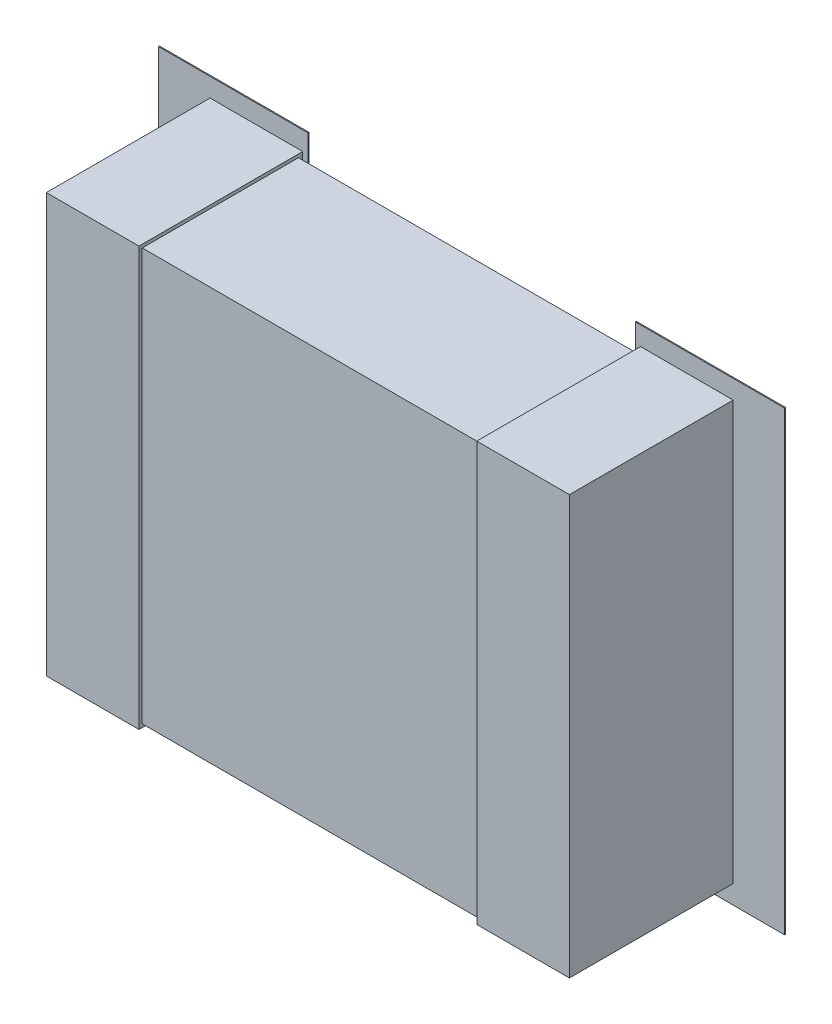
ISO-10303-21;
HEADER;
FILE_DESCRIPTION(('STEP AP214'),'2;1');
FILE_NAME('part.step','',(''),(''),'','','');
FILE_SCHEMA(('AUTOMOTIVE_DESIGN { 1 0 10303 214 1 1 1 1 }'));
ENDSEC;
DATA;
#1=APPLICATION_CONTEXT('core data for automotive mechanical design processes');
#2=APPLICATION_PROTOCOL_DEFINITION('international standard','automotive_design',2000,#1);
#3=PRODUCT_CONTEXT('',#1,'mechanical');
#4=PRODUCT('Part','Part','',(#3));
#5=PRODUCT_RELATED_PRODUCT_CATEGORY('part','',(#4));
#6=PRODUCT_DEFINITION_FORMATION('','',#4);
#7=PRODUCT_DEFINITION_CONTEXT('part definition',#1,'design');
#8=PRODUCT_DEFINITION('design','',#6,#7);
#9=PRODUCT_DEFINITION_SHAPE('','',#8);
#10=(LENGTH_UNIT() NAMED_UNIT(*) SI_UNIT(.MILLI.,.METRE.));
#11=(NAMED_UNIT(*) PLANE_ANGLE_UNIT() SI_UNIT($,.RADIAN.));
#12=(NAMED_UNIT(*) SI_UNIT($,.STERADIAN.) SOLID_ANGLE_UNIT());
#13=UNCERTAINTY_MEASURE_WITH_UNIT(LENGTH_MEASURE(1.E-05),#10,'distance_accuracy_value','');
#14=(GEOMETRIC_REPRESENTATION_CONTEXT(3) GLOBAL_UNCERTAINTY_ASSIGNED_CONTEXT((#13)) GLOBAL_UNIT_ASSIGNED_CONTEXT((#10,
#11,#12)) REPRESENTATION_CONTEXT('',''));
#15=CARTESIAN_POINT('',(0.,0.,0.));
#16=DIRECTION('',(0.,0.,1.));
#17=DIRECTION('',(1.,0.,0.));
#18=AXIS2_PLACEMENT_3D('',#15,#16,#17);
#19=CARTESIAN_POINT('',(0.,0.,0.0762));
#20=DIRECTION('',(0.,0.,1.));
#21=DIRECTION('',(1.,0.,0.));
#22=AXIS2_PLACEMENT_3D('',#19,#20,#21);
#23=PLANE('',#22);
#24=DIRECTION('',(0.,1.,0.));
#25=VECTOR('',#24,1.);
#26=CARTESIAN_POINT('',(-1.59,-2.215,0.0762));
#27=LINE('',#26,#25);
#28=CARTESIAN_POINT('',(-1.59,-2.215,0.0762));
#29=VERTEX_POINT('',#28);
#30=CARTESIAN_POINT('',(-1.59,2.215,0.0762));
#31=VERTEX_POINT('',#30);
#32=EDGE_CURVE('E152',#29,#31,#27,.T.);
#33=ORIENTED_EDGE('',*,*,#32,.F.);
#34=DIRECTION('',(1.,0.,0.));
#35=VECTOR('',#34,1.);
#36=CARTESIAN_POINT('',(-3.04,-2.215,0.0762));
#37=LINE('',#36,#35);
#38=CARTESIAN_POINT('',(-3.04,-2.215,0.0762));
#39=VERTEX_POINT('',#38);
#40=EDGE_CURVE('E20',#39,#29,#37,.T.);
#41=ORIENTED_EDGE('',*,*,#40,.F.);
#42=DIRECTION('',(0.,1.,0.));
#43=VECTOR('',#42,1.);
#44=CARTESIAN_POINT('',(-3.04,2.215,0.0762));
#45=LINE('',#44,#43);
#46=CARTESIAN_POINT('',(-3.04,2.215,0.0762));
#47=VERTEX_POINT('',#46);
#48=EDGE_CURVE('E180',#47,#39,#45,.F.);
#49=ORIENTED_EDGE('',*,*,#48,.F.);
#50=DIRECTION('',(1.,0.,0.));
#51=VECTOR('',#50,1.);
#52=CARTESIAN_POINT('',(-1.59,2.215,0.0762));
#53=LINE('',#52,#51);
#54=EDGE_CURVE('E165',#31,#47,#53,.F.);
#55=ORIENTED_EDGE('',*,*,#54,.F.);
#56=EDGE_LOOP('',(#33,#41,#49,#55));
#57=FACE_BOUND('',#56,.T.);
#58=ADVANCED_FACE('F17',(#57),#23,.F.);
#59=CARTESIAN_POINT('',(0.,0.,0.0762));
#60=DIRECTION('',(0.,0.,1.));
#61=DIRECTION('',(1.,0.,0.));
#62=AXIS2_PLACEMENT_3D('',#59,#60,#61);
#63=PLANE('',#62);
#64=DIRECTION('',(0.,1.,0.));
#65=VECTOR('',#64,1.);
#66=CARTESIAN_POINT('',(1.59,2.215,0.0762));
#67=LINE('',#66,#65);
#68=CARTESIAN_POINT('',(1.59,2.215,0.0762));
#69=VERTEX_POINT('',#68);
#70=CARTESIAN_POINT('',(1.59,-2.215,0.0762));
#71=VERTEX_POINT('',#70);
#72=EDGE_CURVE('E187',#69,#71,#67,.F.);
#73=ORIENTED_EDGE('',*,*,#72,.F.);
#74=DIRECTION('',(1.,0.,0.));
#75=VECTOR('',#74,1.);
#76=CARTESIAN_POINT('',(3.04,2.215,0.0762));
#77=LINE('',#76,#75);
#78=CARTESIAN_POINT('',(3.04,2.215,0.0762));
#79=VERTEX_POINT('',#78);
#80=EDGE_CURVE('E182',#79,#69,#77,.F.);
#81=ORIENTED_EDGE('',*,*,#80,.F.);
#82=DIRECTION('',(0.,1.,0.));
#83=VECTOR('',#82,1.);
#84=CARTESIAN_POINT('',(3.04,-2.215,0.0762));
#85=LINE('',#84,#83);
#86=CARTESIAN_POINT('',(3.04,-2.215,0.0762));
#87=VERTEX_POINT('',#86);
#88=EDGE_CURVE('E200',#87,#79,#85,.T.);
#89=ORIENTED_EDGE('',*,*,#88,.F.);
#90=DIRECTION('',(1.,0.,0.));
#91=VECTOR('',#90,1.);
#92=CARTESIAN_POINT('',(1.59,-2.215,0.0762));
#93=LINE('',#92,#91);
#94=EDGE_CURVE('E192',#71,#87,#93,.T.);
#95=ORIENTED_EDGE('',*,*,#94,.F.);
#96=EDGE_LOOP('',(#73,#81,#89,#95));
#97=FACE_BOUND('',#96,.T.);
#98=ADVANCED_FACE('F426',(#97),#63,.F.);
#99=CARTESIAN_POINT('',(-3.04,-2.215,0.0762));
#100=DIRECTION('',(0.,-1.,0.));
#101=DIRECTION('',(0.,0.,-1.));
#102=AXIS2_PLACEMENT_3D('',#99,#100,#101);
#103=PLANE('',#102);
#104=DIRECTION('',(0.,0.,1.));
#105=VECTOR('',#104,1.);
#106=CARTESIAN_POINT('',(-3.04,-2.215,0.0762));
#107=LINE('',#106,#105);
#108=CARTESIAN_POINT('',(-3.04,-2.215,0.0862));
#109=VERTEX_POINT('',#108);
#110=EDGE_CURVE('E161',#39,#109,#107,.T.);
#111=ORIENTED_EDGE('',*,*,#110,.F.);
#112=ORIENTED_EDGE('',*,*,#40,.T.);
#113=DIRECTION('',(0.,0.,-1.));
#114=VECTOR('',#113,1.);
#115=CARTESIAN_POINT('',(-1.59,-2.215,0.0762));
#116=LINE('',#115,#114);
#117=CARTESIAN_POINT('',(-1.59,-2.215,0.0862));
#118=VERTEX_POINT('',#117);
#119=EDGE_CURVE('E158',#118,#29,#116,.T.);
#120=ORIENTED_EDGE('',*,*,#119,.F.);
#121=DIRECTION('',(1.,0.,0.));
#122=VECTOR('',#121,1.);
#123=CARTESIAN_POINT('',(0.,-2.215,0.0862));
#124=LINE('',#123,#122);
#125=EDGE_CURVE('E217',#109,#118,#124,.T.);
#126=ORIENTED_EDGE('',*,*,#125,.F.);
#127=EDGE_LOOP('',(#111,#112,#120,#126));
#128=FACE_BOUND('',#127,.T.);
#129=ADVANCED_FACE('F157',(#128),#103,.T.);
#130=CARTESIAN_POINT('',(-1.59,-2.215,0.0762));
#131=DIRECTION('',(1.,0.,0.));
#132=DIRECTION('',(0.,0.,-1.));
#133=AXIS2_PLACEMENT_3D('',#130,#131,#132);
#134=PLANE('',#133);
#135=ORIENTED_EDGE('',*,*,#119,.T.);
#136=ORIENTED_EDGE('',*,*,#32,.T.);
#137=DIRECTION('',(0.,0.,1.));
#138=VECTOR('',#137,1.);
#139=CARTESIAN_POINT('',(-1.59,2.215,0.0762));
#140=LINE('',#139,#138);
#141=CARTESIAN_POINT('',(-1.59,2.215,0.0862));
#142=VERTEX_POINT('',#141);
#143=EDGE_CURVE('E167',#142,#31,#140,.F.);
#144=ORIENTED_EDGE('',*,*,#143,.F.);
#145=DIRECTION('',(0.,1.,0.));
#146=VECTOR('',#145,1.);
#147=CARTESIAN_POINT('',(-1.59,0.,0.0862));
#148=LINE('',#147,#146);
#149=EDGE_CURVE('E171',#118,#142,#148,.T.);
#150=ORIENTED_EDGE('',*,*,#149,.F.);
#151=EDGE_LOOP('',(#135,#136,#144,#150));
#152=FACE_BOUND('',#151,.T.);
#153=ADVANCED_FACE('F169',(#152),#134,.T.);
#154=CARTESIAN_POINT('',(-1.59,2.215,0.0762));
#155=DIRECTION('',(0.,1.,0.));
#156=DIRECTION('',(0.,0.,1.));
#157=AXIS2_PLACEMENT_3D('',#154,#155,#156);
#158=PLANE('',#157);
#159=ORIENTED_EDGE('',*,*,#143,.T.);
#160=ORIENTED_EDGE('',*,*,#54,.T.);
#161=DIRECTION('',(0.,0.,1.));
#162=VECTOR('',#161,1.);
#163=CARTESIAN_POINT('',(-3.04,2.215,0.0762));
#164=LINE('',#163,#162);
#165=CARTESIAN_POINT('',(-3.04,2.215,0.0862));
#166=VERTEX_POINT('',#165);
#167=EDGE_CURVE('E177',#166,#47,#164,.F.);
#168=ORIENTED_EDGE('',*,*,#167,.F.);
#169=DIRECTION('',(1.,0.,0.));
#170=VECTOR('',#169,1.);
#171=CARTESIAN_POINT('',(0.,2.215,0.0862));
#172=LINE('',#171,#170);
#173=EDGE_CURVE('E220',#142,#166,#172,.F.);
#174=ORIENTED_EDGE('',*,*,#173,.F.);
#175=EDGE_LOOP('',(#159,#160,#168,#174));
#176=FACE_BOUND('',#175,.T.);
#177=ADVANCED_FACE('F364',(#176),#158,.T.);
#178=CARTESIAN_POINT('',(-3.04,2.215,0.0762));
#179=DIRECTION('',(-1.,0.,0.));
#180=DIRECTION('',(0.,0.,1.));
#181=AXIS2_PLACEMENT_3D('',#178,#179,#180);
#182=PLANE('',#181);
#183=ORIENTED_EDGE('',*,*,#167,.T.);
#184=ORIENTED_EDGE('',*,*,#48,.T.);
#185=ORIENTED_EDGE('',*,*,#110,.T.);
#186=DIRECTION('',(0.,1.,0.));
#187=VECTOR('',#186,1.);
#188=CARTESIAN_POINT('',(-3.04,0.,0.0862));
#189=LINE('',#188,#187);
#190=EDGE_CURVE('E223',#166,#109,#189,.F.);
#191=ORIENTED_EDGE('',*,*,#190,.F.);
#192=EDGE_LOOP('',(#183,#184,#185,#191));
#193=FACE_BOUND('',#192,.T.);
#194=ADVANCED_FACE('F354',(#193),#182,.T.);
#195=CARTESIAN_POINT('',(-2.54,2.0325,0.0762));
#196=DIRECTION('',(-1.,0.,0.));
#197=DIRECTION('',(0.,0.,1.));
#198=AXIS2_PLACEMENT_3D('',#195,#196,#197);
#199=PLANE('',#198);
#200=DIRECTION('',(0.,0.,1.));
#201=VECTOR('',#200,1.);
#202=CARTESIAN_POINT('',(-2.54,2.0325,0.0762));
#203=LINE('',#202,#201);
#204=CARTESIAN_POINT('',(-2.54,2.0325,0.0862));
#205=VERTEX_POINT('',#204);
#206=CARTESIAN_POINT('',(-2.54,2.0325,1.6762));
#207=VERTEX_POINT('',#206);
#208=EDGE_CURVE('E205',#205,#207,#203,.T.);
#209=ORIENTED_EDGE('',*,*,#208,.F.);
#210=DIRECTION('',(0.,1.,0.));
#211=VECTOR('',#210,1.);
#212=CARTESIAN_POINT('',(-2.54,0.,0.0862));
#213=LINE('',#212,#211);
#214=CARTESIAN_POINT('',(-2.54,-2.0325,0.0862));
#215=VERTEX_POINT('',#214);
#216=EDGE_CURVE('E232',#215,#205,#213,.T.);
#217=ORIENTED_EDGE('',*,*,#216,.F.);
#218=DIRECTION('',(0.,0.,-1.));
#219=VECTOR('',#218,1.);
#220=CARTESIAN_POINT('',(-2.54,-2.0325,0.0762));
#221=LINE('',#220,#219);
#222=CARTESIAN_POINT('',(-2.54,-2.0325,1.6762));
#223=VERTEX_POINT('',#222);
#224=EDGE_CURVE('E215',#223,#215,#221,.T.);
#225=ORIENTED_EDGE('',*,*,#224,.F.);
#226=DIRECTION('',(0.,1.,0.));
#227=VECTOR('',#226,1.);
#228=CARTESIAN_POINT('',(-2.54,0.,1.6762));
#229=LINE('',#228,#227);
#230=EDGE_CURVE('E210',#207,#223,#229,.F.);
#231=ORIENTED_EDGE('',*,*,#230,.F.);
#232=EDGE_LOOP('',(#209,#217,#225,#231));
#233=FACE_BOUND('',#232,.T.);
#234=ADVANCED_FACE('F351',(#233),#199,.T.);
#235=CARTESIAN_POINT('',(3.04,2.215,0.0762));
#236=DIRECTION('',(0.,1.,0.));
#237=DIRECTION('',(0.,0.,1.));
#238=AXIS2_PLACEMENT_3D('',#235,#236,#237);
#239=PLANE('',#238);
#240=DIRECTION('',(0.,0.,-1.));
#241=VECTOR('',#240,1.);
#242=CARTESIAN_POINT('',(3.04,2.215,0.0762));
#243=LINE('',#242,#241);
#244=CARTESIAN_POINT('',(3.04,2.215,0.0862));
#245=VERTEX_POINT('',#244);
#246=EDGE_CURVE('E194',#79,#245,#243,.F.);
#247=ORIENTED_EDGE('',*,*,#246,.F.);
#248=ORIENTED_EDGE('',*,*,#80,.T.);
#249=DIRECTION('',(0.,0.,1.));
#250=VECTOR('',#249,1.);
#251=CARTESIAN_POINT('',(1.59,2.215,0.0762));
#252=LINE('',#251,#250);
#253=CARTESIAN_POINT('',(1.59,2.215,0.0862));
#254=VERTEX_POINT('',#253);
#255=EDGE_CURVE('E184',#254,#69,#252,.F.);
#256=ORIENTED_EDGE('',*,*,#255,.F.);
#257=DIRECTION('',(1.,0.,0.));
#258=VECTOR('',#257,1.);
#259=CARTESIAN_POINT('',(0.,2.215,0.0862));
#260=LINE('',#259,#258);
#261=EDGE_CURVE('E235',#245,#254,#260,.F.);
#262=ORIENTED_EDGE('',*,*,#261,.F.);
#263=EDGE_LOOP('',(#247,#248,#256,#262));
#264=FACE_BOUND('',#263,.T.);
#265=ADVANCED_FACE('F353',(#264),#239,.T.);
#266=CARTESIAN_POINT('',(1.59,2.215,0.0762));
#267=DIRECTION('',(-1.,0.,0.));
#268=DIRECTION('',(0.,0.,1.));
#269=AXIS2_PLACEMENT_3D('',#266,#267,#268);
#270=PLANE('',#269);
#271=ORIENTED_EDGE('',*,*,#255,.T.);
#272=ORIENTED_EDGE('',*,*,#72,.T.);
#273=DIRECTION('',(0.,0.,-1.));
#274=VECTOR('',#273,1.);
#275=CARTESIAN_POINT('',(1.59,-2.215,0.0762));
#276=LINE('',#275,#274);
#277=CARTESIAN_POINT('',(1.59,-2.215,0.0862));
#278=VERTEX_POINT('',#277);
#279=EDGE_CURVE('E189',#278,#71,#276,.T.);
#280=ORIENTED_EDGE('',*,*,#279,.F.);
#281=DIRECTION('',(0.,1.,0.));
#282=VECTOR('',#281,1.);
#283=CARTESIAN_POINT('',(1.59,0.,0.0862));
#284=LINE('',#283,#282);
#285=EDGE_CURVE('E238',#254,#278,#284,.F.);
#286=ORIENTED_EDGE('',*,*,#285,.F.);
#287=EDGE_LOOP('',(#271,#272,#280,#286));
#288=FACE_BOUND('',#287,.T.);
#289=ADVANCED_FACE('F361',(#288),#270,.T.);
#290=CARTESIAN_POINT('',(1.59,-2.215,0.0762));
#291=DIRECTION('',(0.,-1.,0.));
#292=DIRECTION('',(0.,0.,-1.));
#293=AXIS2_PLACEMENT_3D('',#290,#291,#292);
#294=PLANE('',#293);
#295=ORIENTED_EDGE('',*,*,#279,.T.);
#296=ORIENTED_EDGE('',*,*,#94,.T.);
#297=DIRECTION('',(0.,0.,-1.));
#298=VECTOR('',#297,1.);
#299=CARTESIAN_POINT('',(3.04,-2.215,0.0762));
#300=LINE('',#299,#298);
#301=CARTESIAN_POINT('',(3.04,-2.215,0.0862));
#302=VERTEX_POINT('',#301);
#303=EDGE_CURVE('E197',#302,#87,#300,.T.);
#304=ORIENTED_EDGE('',*,*,#303,.F.);
#305=DIRECTION('',(1.,0.,0.));
#306=VECTOR('',#305,1.);
#307=CARTESIAN_POINT('',(0.,-2.215,0.0862));
#308=LINE('',#307,#306);
#309=EDGE_CURVE('E241',#278,#302,#308,.T.);
#310=ORIENTED_EDGE('',*,*,#309,.F.);
#311=EDGE_LOOP('',(#295,#296,#304,#310));
#312=FACE_BOUND('',#311,.T.);
#313=ADVANCED_FACE('F411',(#312),#294,.T.);
#314=CARTESIAN_POINT('',(3.04,-2.215,0.0762));
#315=DIRECTION('',(1.,0.,0.));
#316=DIRECTION('',(0.,0.,-1.));
#317=AXIS2_PLACEMENT_3D('',#314,#315,#316);
#318=PLANE('',#317);
#319=ORIENTED_EDGE('',*,*,#303,.T.);
#320=ORIENTED_EDGE('',*,*,#88,.T.);
#321=ORIENTED_EDGE('',*,*,#246,.T.);
#322=DIRECTION('',(0.,1.,0.));
#323=VECTOR('',#322,1.);
#324=CARTESIAN_POINT('',(3.04,0.,0.0862));
#325=LINE('',#324,#323);
#326=EDGE_CURVE('E244',#302,#245,#325,.T.);
#327=ORIENTED_EDGE('',*,*,#326,.F.);
#328=EDGE_LOOP('',(#319,#320,#321,#327));
#329=FACE_BOUND('',#328,.T.);
#330=ADVANCED_FACE('F407',(#329),#318,.T.);
#331=CARTESIAN_POINT('',(2.54,-2.0325,0.0762));
#332=DIRECTION('',(1.,0.,0.));
#333=DIRECTION('',(0.,0.,-1.));
#334=AXIS2_PLACEMENT_3D('',#331,#332,#333);
#335=PLANE('',#334);
#336=DIRECTION('',(0.,0.,-1.));
#337=VECTOR('',#336,1.);
#338=CARTESIAN_POINT('',(2.54,-2.0325,0.0762));
#339=LINE('',#338,#337);
#340=CARTESIAN_POINT('',(2.54,-2.0325,1.6762));
#341=VERTEX_POINT('',#340);
#342=CARTESIAN_POINT('',(2.54,-2.0325,0.0862));
#343=VERTEX_POINT('',#342);
#344=EDGE_CURVE('E203',#341,#343,#339,.T.);
#345=ORIENTED_EDGE('',*,*,#344,.T.);
#346=DIRECTION('',(0.,1.,0.));
#347=VECTOR('',#346,1.);
#348=CARTESIAN_POINT('',(2.54,0.,0.0862));
#349=LINE('',#348,#347);
#350=CARTESIAN_POINT('',(2.54,2.0325,0.0862));
#351=VERTEX_POINT('',#350);
#352=EDGE_CURVE('E247',#351,#343,#349,.F.);
#353=ORIENTED_EDGE('',*,*,#352,.F.);
#354=DIRECTION('',(0.,0.,1.));
#355=VECTOR('',#354,1.);
#356=CARTESIAN_POINT('',(2.54,2.0325,0.0762));
#357=LINE('',#356,#355);
#358=CARTESIAN_POINT('',(2.54,2.0325,1.6762));
#359=VERTEX_POINT('',#358);
#360=EDGE_CURVE('E250',#359,#351,#357,.F.);
#361=ORIENTED_EDGE('',*,*,#360,.F.);
#362=DIRECTION('',(0.,1.,0.));
#363=VECTOR('',#362,1.);
#364=CARTESIAN_POINT('',(2.54,0.,1.6762));
#365=LINE('',#364,#363);
#366=EDGE_CURVE('E256',#341,#359,#365,.T.);
#367=ORIENTED_EDGE('',*,*,#366,.F.);
#368=EDGE_LOOP('',(#345,#353,#361,#367));
#369=FACE_BOUND('',#368,.T.);
#370=ADVANCED_FACE('F404',(#369),#335,.T.);
#371=CARTESIAN_POINT('',(2.54,2.0325,0.0762));
#372=DIRECTION('',(0.,1.,0.));
#373=DIRECTION('',(0.,0.,1.));
#374=AXIS2_PLACEMENT_3D('',#371,#372,#373);
#375=PLANE('',#374);
#376=DIRECTION('',(0.,0.,-1.));
#377=VECTOR('',#376,1.);
#378=CARTESIAN_POINT('',(-1.64,2.0325,0.));
#379=LINE('',#378,#377);
#380=CARTESIAN_POINT('',(-1.64,2.0325,0.0862));
#381=VERTEX_POINT('',#380);
#382=CARTESIAN_POINT('',(-1.64,2.0325,1.6762));
#383=VERTEX_POINT('',#382);
#384=EDGE_CURVE('E268',#381,#383,#379,.F.);
#385=ORIENTED_EDGE('',*,*,#384,.F.);
#386=DIRECTION('',(1.,0.,0.));
#387=VECTOR('',#386,1.);
#388=CARTESIAN_POINT('',(0.,2.0325,0.0862));
#389=LINE('',#388,#387);
#390=EDGE_CURVE('E226',#205,#381,#389,.T.);
#391=ORIENTED_EDGE('',*,*,#390,.F.);
#392=ORIENTED_EDGE('',*,*,#208,.T.);
#393=DIRECTION('',(1.,0.,0.));
#394=VECTOR('',#393,1.);
#395=CARTESIAN_POINT('',(0.,2.0325,1.6762));
#396=LINE('',#395,#394);
#397=EDGE_CURVE('E207',#383,#207,#396,.F.);
#398=ORIENTED_EDGE('',*,*,#397,.F.);
#399=EDGE_LOOP('',(#385,#391,#392,#398));
#400=FACE_BOUND('',#399,.T.);
#401=ADVANCED_FACE('F346',(#400),#375,.T.);
#402=CARTESIAN_POINT('',(0.,0.,1.6762));
#403=DIRECTION('',(0.,0.,1.));
#404=DIRECTION('',(1.,0.,0.));
#405=AXIS2_PLACEMENT_3D('',#402,#403,#404);
#406=PLANE('',#405);
#407=DIRECTION('',(1.,0.,0.));
#408=VECTOR('',#407,1.);
#409=CARTESIAN_POINT('',(-2.54,-2.0325,1.6762));
#410=LINE('',#409,#408);
#411=CARTESIAN_POINT('',(-1.64,-2.0325,1.6762));
#412=VERTEX_POINT('',#411);
#413=EDGE_CURVE('E212',#412,#223,#410,.F.);
#414=ORIENTED_EDGE('',*,*,#413,.F.);
#415=DIRECTION('',(0.,1.,0.));
#416=VECTOR('',#415,1.);
#417=CARTESIAN_POINT('',(-1.64,0.,1.6762));
#418=LINE('',#417,#416);
#419=EDGE_CURVE('E271',#383,#412,#418,.F.);
#420=ORIENTED_EDGE('',*,*,#419,.F.);
#421=ORIENTED_EDGE('',*,*,#397,.T.);
#422=ORIENTED_EDGE('',*,*,#230,.T.);
#423=EDGE_LOOP('',(#414,#420,#421,#422));
#424=FACE_BOUND('',#423,.T.);
#425=ADVANCED_FACE('F349',(#424),#406,.T.);
#426=CARTESIAN_POINT('',(-2.54,-2.0325,0.0762));
#427=DIRECTION('',(0.,-1.,0.));
#428=DIRECTION('',(0.,0.,-1.));
#429=AXIS2_PLACEMENT_3D('',#426,#427,#428);
#430=PLANE('',#429);
#431=ORIENTED_EDGE('',*,*,#224,.T.);
#432=DIRECTION('',(1.,0.,0.));
#433=VECTOR('',#432,1.);
#434=CARTESIAN_POINT('',(0.,-2.0325,0.0862));
#435=LINE('',#434,#433);
#436=CARTESIAN_POINT('',(-1.64,-2.0325,0.0862));
#437=VERTEX_POINT('',#436);
#438=EDGE_CURVE('E229',#437,#215,#435,.F.);
#439=ORIENTED_EDGE('',*,*,#438,.F.);
#440=DIRECTION('',(0.,0.,-1.));
#441=VECTOR('',#440,1.);
#442=CARTESIAN_POINT('',(-1.64,-2.0325,0.));
#443=LINE('',#442,#441);
#444=EDGE_CURVE('E274',#412,#437,#443,.T.);
#445=ORIENTED_EDGE('',*,*,#444,.F.);
#446=ORIENTED_EDGE('',*,*,#413,.T.);
#447=EDGE_LOOP('',(#431,#439,#445,#446));
#448=FACE_BOUND('',#447,.T.);
#449=ADVANCED_FACE('F338',(#448),#430,.T.);
#450=CARTESIAN_POINT('',(0.,0.,0.0862));
#451=DIRECTION('',(0.,0.,1.));
#452=DIRECTION('',(1.,0.,0.));
#453=AXIS2_PLACEMENT_3D('',#450,#451,#452);
#454=PLANE('',#453);
#455=ORIENTED_EDGE('',*,*,#438,.T.);
#456=ORIENTED_EDGE('',*,*,#216,.T.);
#457=ORIENTED_EDGE('',*,*,#390,.T.);
#458=DIRECTION('',(0.,1.,0.));
#459=VECTOR('',#458,1.);
#460=CARTESIAN_POINT('',(-1.64,0.,0.0862));
#461=LINE('',#460,#459);
#462=EDGE_CURVE('E277',#437,#381,#461,.T.);
#463=ORIENTED_EDGE('',*,*,#462,.F.);
#464=EDGE_LOOP('',(#455,#456,#457,#463));
#465=FACE_BOUND('',#464,.T.);
#466=ORIENTED_EDGE('',*,*,#173,.T.);
#467=ORIENTED_EDGE('',*,*,#190,.T.);
#468=ORIENTED_EDGE('',*,*,#125,.T.);
#469=ORIENTED_EDGE('',*,*,#149,.T.);
#470=EDGE_LOOP('',(#466,#467,#468,#469));
#471=FACE_BOUND('',#470,.T.);
#472=ADVANCED_FACE('F342',(#465,#471),#454,.T.);
#473=CARTESIAN_POINT('',(0.,0.,0.0862));
#474=DIRECTION('',(0.,0.,1.));
#475=DIRECTION('',(1.,0.,0.));
#476=AXIS2_PLACEMENT_3D('',#473,#474,#475);
#477=PLANE('',#476);
#478=ORIENTED_EDGE('',*,*,#352,.T.);
#479=DIRECTION('',(1.,0.,0.));
#480=VECTOR('',#479,1.);
#481=CARTESIAN_POINT('',(-2.54,-2.0325,0.0862));
#482=LINE('',#481,#480);
#483=CARTESIAN_POINT('',(1.64,-2.0325,0.0862));
#484=VERTEX_POINT('',#483);
#485=EDGE_CURVE('E265',#484,#343,#482,.T.);
#486=ORIENTED_EDGE('',*,*,#485,.F.);
#487=DIRECTION('',(0.,1.,0.));
#488=VECTOR('',#487,1.);
#489=CARTESIAN_POINT('',(1.64,0.,0.0862));
#490=LINE('',#489,#488);
#491=CARTESIAN_POINT('',(1.64,2.0325,0.0862));
#492=VERTEX_POINT('',#491);
#493=EDGE_CURVE('E287',#484,#492,#490,.T.);
#494=ORIENTED_EDGE('',*,*,#493,.T.);
#495=DIRECTION('',(1.,0.,0.));
#496=VECTOR('',#495,1.);
#497=CARTESIAN_POINT('',(2.54,2.0325,0.0862));
#498=LINE('',#497,#496);
#499=EDGE_CURVE('E253',#351,#492,#498,.F.);
#500=ORIENTED_EDGE('',*,*,#499,.F.);
#501=EDGE_LOOP('',(#478,#486,#494,#500));
#502=FACE_BOUND('',#501,.T.);
#503=ORIENTED_EDGE('',*,*,#309,.T.);
#504=ORIENTED_EDGE('',*,*,#326,.T.);
#505=ORIENTED_EDGE('',*,*,#261,.T.);
#506=ORIENTED_EDGE('',*,*,#285,.T.);
#507=EDGE_LOOP('',(#503,#504,#505,#506));
#508=FACE_BOUND('',#507,.T.);
#509=ADVANCED_FACE('F391',(#502,#508),#477,.T.);
#510=CARTESIAN_POINT('',(2.54,2.0325,0.0762));
#511=DIRECTION('',(0.,1.,0.));
#512=DIRECTION('',(0.,0.,1.));
#513=AXIS2_PLACEMENT_3D('',#510,#511,#512);
#514=PLANE('',#513);
#515=ORIENTED_EDGE('',*,*,#360,.T.);
#516=ORIENTED_EDGE('',*,*,#499,.T.);
#517=DIRECTION('',(0.,0.,-1.));
#518=VECTOR('',#517,1.);
#519=CARTESIAN_POINT('',(1.64,2.0325,0.));
#520=LINE('',#519,#518);
#521=CARTESIAN_POINT('',(1.64,2.0325,1.6762));
#522=VERTEX_POINT('',#521);
#523=EDGE_CURVE('E289',#492,#522,#520,.F.);
#524=ORIENTED_EDGE('',*,*,#523,.T.);
#525=DIRECTION('',(1.,0.,0.));
#526=VECTOR('',#525,1.);
#527=CARTESIAN_POINT('',(0.,2.0325,1.6762));
#528=LINE('',#527,#526);
#529=EDGE_CURVE('E259',#359,#522,#528,.F.);
#530=ORIENTED_EDGE('',*,*,#529,.F.);
#531=EDGE_LOOP('',(#515,#516,#524,#530));
#532=FACE_BOUND('',#531,.T.);
#533=ADVANCED_FACE('F387',(#532),#514,.T.);
#534=CARTESIAN_POINT('',(0.,0.,1.6762));
#535=DIRECTION('',(0.,0.,1.));
#536=DIRECTION('',(1.,0.,0.));
#537=AXIS2_PLACEMENT_3D('',#534,#535,#536);
#538=PLANE('',#537);
#539=ORIENTED_EDGE('',*,*,#529,.T.);
#540=DIRECTION('',(0.,1.,0.));
#541=VECTOR('',#540,1.);
#542=CARTESIAN_POINT('',(1.64,0.,1.6762));
#543=LINE('',#542,#541);
#544=CARTESIAN_POINT('',(1.64,-2.0325,1.6762));
#545=VERTEX_POINT('',#544);
#546=EDGE_CURVE('E291',#522,#545,#543,.F.);
#547=ORIENTED_EDGE('',*,*,#546,.T.);
#548=DIRECTION('',(1.,0.,0.));
#549=VECTOR('',#548,1.);
#550=CARTESIAN_POINT('',(-2.54,-2.0325,1.6762));
#551=LINE('',#550,#549);
#552=EDGE_CURVE('E262',#341,#545,#551,.F.);
#553=ORIENTED_EDGE('',*,*,#552,.F.);
#554=ORIENTED_EDGE('',*,*,#366,.T.);
#555=EDGE_LOOP('',(#539,#547,#553,#554));
#556=FACE_BOUND('',#555,.T.);
#557=ADVANCED_FACE('F383',(#556),#538,.T.);
#558=CARTESIAN_POINT('',(-2.54,-2.0325,0.0762));
#559=DIRECTION('',(0.,-1.,0.));
#560=DIRECTION('',(0.,0.,-1.));
#561=AXIS2_PLACEMENT_3D('',#558,#559,#560);
#562=PLANE('',#561);
#563=DIRECTION('',(0.,0.,-1.));
#564=VECTOR('',#563,1.);
#565=CARTESIAN_POINT('',(1.64,-2.0325,0.));
#566=LINE('',#565,#564);
#567=EDGE_CURVE('E293',#545,#484,#566,.T.);
#568=ORIENTED_EDGE('',*,*,#567,.T.);
#569=ORIENTED_EDGE('',*,*,#485,.T.);
#570=ORIENTED_EDGE('',*,*,#344,.F.);
#571=ORIENTED_EDGE('',*,*,#552,.T.);
#572=EDGE_LOOP('',(#568,#569,#570,#571));
#573=FACE_BOUND('',#572,.T.);
#574=ADVANCED_FACE('F380',(#573),#562,.T.);
#575=CARTESIAN_POINT('',(-1.64,-2.001,1.6447));
#576=DIRECTION('',(0.,0.,-1.));
#577=DIRECTION('',(-1.,0.,0.));
#578=AXIS2_PLACEMENT_3D('',#575,#576,#577);
#579=PLANE('',#578);
#580=DIRECTION('',(0.,1.,0.));
#581=VECTOR('',#580,1.);
#582=CARTESIAN_POINT('',(1.64,0.,1.6447));
#583=LINE('',#582,#581);
#584=CARTESIAN_POINT('',(1.64,-2.001,1.6447));
#585=VERTEX_POINT('',#584);
#586=CARTESIAN_POINT('',(1.64,2.001,1.6447));
#587=VERTEX_POINT('',#586);
#588=EDGE_CURVE('E298',#585,#587,#583,.T.);
#589=ORIENTED_EDGE('',*,*,#588,.T.);
#590=DIRECTION('',(1.,0.,0.));
#591=VECTOR('',#590,1.);
#592=CARTESIAN_POINT('',(-1.64,2.001,1.6447));
#593=LINE('',#592,#591);
#594=CARTESIAN_POINT('',(-1.64,2.001,1.6447));
#595=VERTEX_POINT('',#594);
#596=EDGE_CURVE('E283',#587,#595,#593,.F.);
#597=ORIENTED_EDGE('',*,*,#596,.T.);
#598=DIRECTION('',(0.,1.,0.));
#599=VECTOR('',#598,1.);
#600=CARTESIAN_POINT('',(-1.64,0.,1.6447));
#601=LINE('',#600,#599);
#602=CARTESIAN_POINT('',(-1.64,-2.001,1.6447));
#603=VERTEX_POINT('',#602);
#604=EDGE_CURVE('E280',#603,#595,#601,.T.);
#605=ORIENTED_EDGE('',*,*,#604,.F.);
#606=DIRECTION('',(1.,0.,0.));
#607=VECTOR('',#606,1.);
#608=CARTESIAN_POINT('',(-1.64,-2.001,1.6447));
#609=LINE('',#608,#607);
#610=EDGE_CURVE('E304',#603,#585,#609,.T.);
#611=ORIENTED_EDGE('',*,*,#610,.T.);
#612=EDGE_LOOP('',(#589,#597,#605,#611));
#613=FACE_BOUND('',#612,.T.);
#614=ADVANCED_FACE('F324',(#613),#579,.F.);
#615=CARTESIAN_POINT('',(-1.64,0.,0.));
#616=DIRECTION('',(1.,0.,0.));
#617=DIRECTION('',(0.,0.,-1.));
#618=AXIS2_PLACEMENT_3D('',#615,#616,#617);
#619=PLANE('',#618);
#620=DIRECTION('',(0.,1.,0.));
#621=VECTOR('',#620,1.);
#622=CARTESIAN_POINT('',(-1.64,0.,0.1277));
#623=LINE('',#622,#621);
#624=CARTESIAN_POINT('',(-1.64,-2.001,0.1277));
#625=VERTEX_POINT('',#624);
#626=CARTESIAN_POINT('',(-1.64,2.001,0.1277));
#627=VERTEX_POINT('',#626);
#628=EDGE_CURVE('E307',#625,#627,#623,.T.);
#629=ORIENTED_EDGE('',*,*,#628,.F.);
#630=DIRECTION('',(0.,0.,1.));
#631=VECTOR('',#630,1.);
#632=CARTESIAN_POINT('',(-1.64,-2.001,0.1077));
#633=LINE('',#632,#631);
#634=EDGE_CURVE('E301',#625,#603,#633,.T.);
#635=ORIENTED_EDGE('',*,*,#634,.T.);
#636=ORIENTED_EDGE('',*,*,#604,.T.);
#637=DIRECTION('',(0.,0.,-1.));
#638=VECTOR('',#637,1.);
#639=CARTESIAN_POINT('',(-1.64,2.001,1.6447));
#640=LINE('',#639,#638);
#641=EDGE_CURVE('E285',#595,#627,#640,.T.);
#642=ORIENTED_EDGE('',*,*,#641,.T.);
#643=EDGE_LOOP('',(#629,#635,#636,#642));
#644=FACE_BOUND('',#643,.T.);
#645=ORIENTED_EDGE('',*,*,#444,.T.);
#646=ORIENTED_EDGE('',*,*,#462,.T.);
#647=ORIENTED_EDGE('',*,*,#384,.T.);
#648=ORIENTED_EDGE('',*,*,#419,.T.);
#649=EDGE_LOOP('',(#645,#646,#647,#648));
#650=FACE_BOUND('',#649,.T.);
#651=ADVANCED_FACE('F330',(#644,#650),#619,.T.);
#652=CARTESIAN_POINT('',(-1.64,2.001,1.6447));
#653=DIRECTION('',(0.,-1.,0.));
#654=DIRECTION('',(0.,0.,-1.));
#655=AXIS2_PLACEMENT_3D('',#652,#653,#654);
#656=PLANE('',#655);
#657=ORIENTED_EDGE('',*,*,#596,.F.);
#658=DIRECTION('',(0.,0.,-1.));
#659=VECTOR('',#658,1.);
#660=CARTESIAN_POINT('',(1.64,2.001,0.));
#661=LINE('',#660,#659);
#662=CARTESIAN_POINT('',(1.64,2.001,0.1277));
#663=VERTEX_POINT('',#662);
#664=EDGE_CURVE('E296',#587,#663,#661,.T.);
#665=ORIENTED_EDGE('',*,*,#664,.T.);
#666=DIRECTION('',(-1.,0.,0.));
#667=VECTOR('',#666,1.);
#668=CARTESIAN_POINT('',(-1.64,2.001,0.1277));
#669=LINE('',#668,#667);
#670=EDGE_CURVE('E310',#627,#663,#669,.F.);
#671=ORIENTED_EDGE('',*,*,#670,.F.);
#672=ORIENTED_EDGE('',*,*,#641,.F.);
#673=EDGE_LOOP('',(#657,#665,#671,#672));
#674=FACE_BOUND('',#673,.T.);
#675=ADVANCED_FACE('F321',(#674),#656,.F.);
#676=CARTESIAN_POINT('',(1.64,0.,0.));
#677=DIRECTION('',(1.,0.,0.));
#678=DIRECTION('',(0.,0.,-1.));
#679=AXIS2_PLACEMENT_3D('',#676,#677,#678);
#680=PLANE('',#679);
#681=DIRECTION('',(0.,0.,1.));
#682=VECTOR('',#681,1.);
#683=CARTESIAN_POINT('',(1.64,-2.001,0.1077));
#684=LINE('',#683,#682);
#685=CARTESIAN_POINT('',(1.64,-2.001,0.1277));
#686=VERTEX_POINT('',#685);
#687=EDGE_CURVE('E35',#585,#686,#684,.F.);
#688=ORIENTED_EDGE('',*,*,#687,.T.);
#689=DIRECTION('',(0.,1.,0.));
#690=VECTOR('',#689,1.);
#691=CARTESIAN_POINT('',(1.64,0.,0.1277));
#692=LINE('',#691,#690);
#693=EDGE_CURVE('E26',#663,#686,#692,.F.);
#694=ORIENTED_EDGE('',*,*,#693,.F.);
#695=ORIENTED_EDGE('',*,*,#664,.F.);
#696=ORIENTED_EDGE('',*,*,#588,.F.);
#697=EDGE_LOOP('',(#688,#694,#695,#696));
#698=FACE_BOUND('',#697,.T.);
#699=ORIENTED_EDGE('',*,*,#546,.F.);
#700=ORIENTED_EDGE('',*,*,#523,.F.);
#701=ORIENTED_EDGE('',*,*,#493,.F.);
#702=ORIENTED_EDGE('',*,*,#567,.F.);
#703=EDGE_LOOP('',(#699,#700,#701,#702));
#704=FACE_BOUND('',#703,.T.);
#705=ADVANCED_FACE('F318',(#698,#704),#680,.F.);
#706=CARTESIAN_POINT('',(-1.64,-2.001,0.1077));
#707=DIRECTION('',(0.,1.,0.));
#708=DIRECTION('',(0.,0.,1.));
#709=AXIS2_PLACEMENT_3D('',#706,#707,#708);
#710=PLANE('',#709);
#711=ORIENTED_EDGE('',*,*,#610,.F.);
#712=ORIENTED_EDGE('',*,*,#634,.F.);
#713=DIRECTION('',(-1.,0.,0.));
#714=VECTOR('',#713,1.);
#715=CARTESIAN_POINT('',(-1.64,-2.001,0.1277));
#716=LINE('',#715,#714);
#717=EDGE_CURVE('E11',#686,#625,#716,.T.);
#718=ORIENTED_EDGE('',*,*,#717,.F.);
#719=ORIENTED_EDGE('',*,*,#687,.F.);
#720=EDGE_LOOP('',(#711,#712,#718,#719));
#721=FACE_BOUND('',#720,.T.);
#722=ADVANCED_FACE('F328',(#721),#710,.F.);
#723=CARTESIAN_POINT('',(-1.64,0.,0.1277));
#724=DIRECTION('',(0.,0.,-1.));
#725=DIRECTION('',(-1.,0.,0.));
#726=AXIS2_PLACEMENT_3D('',#723,#724,#725);
#727=PLANE('',#726);
#728=ORIENTED_EDGE('',*,*,#693,.T.);
#729=ORIENTED_EDGE('',*,*,#717,.T.);
#730=ORIENTED_EDGE('',*,*,#628,.T.);
#731=ORIENTED_EDGE('',*,*,#670,.T.);
#732=EDGE_LOOP('',(#728,#729,#730,#731));
#733=FACE_BOUND('',#732,.T.);
#734=ADVANCED_FACE('F315',(#733),#727,.T.);
#735=CLOSED_SHELL('',(#58,#98,#129,#153,#177,#194,#234,#265,#289,#313,#330,#370,#401,#425,#449,
#472,#509,#533,#557,#574,#614,#651,#675,#705,#722,#734));
#736=MANIFOLD_SOLID_BREP('B1',#735);
#737=ADVANCED_BREP_SHAPE_REPRESENTATION('',(#18,#736),#14);
#738=SHAPE_DEFINITION_REPRESENTATION(#9,#737);
ENDSEC;
END-ISO-10303-21;
